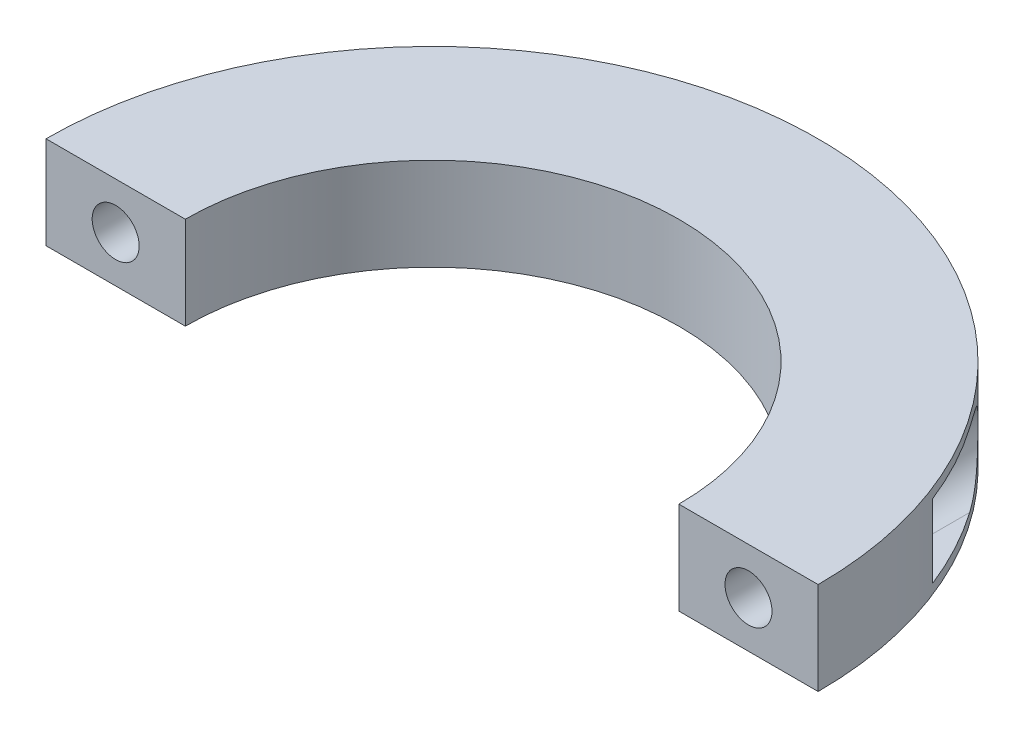
ISO-10303-21;
HEADER;
FILE_DESCRIPTION(('STEP AP214'),'2;1');
FILE_NAME('part.step','',(''),(''),'','','');
FILE_SCHEMA(('AUTOMOTIVE_DESIGN { 1 0 10303 214 1 1 1 1 }'));
ENDSEC;
DATA;
#1=APPLICATION_CONTEXT('core data for automotive mechanical design processes');
#2=APPLICATION_PROTOCOL_DEFINITION('international standard','automotive_design',2000,#1);
#3=PRODUCT_CONTEXT('',#1,'mechanical');
#4=PRODUCT('Part','Part','',(#3));
#5=PRODUCT_RELATED_PRODUCT_CATEGORY('part','',(#4));
#6=PRODUCT_DEFINITION_FORMATION('','',#4);
#7=PRODUCT_DEFINITION_CONTEXT('part definition',#1,'design');
#8=PRODUCT_DEFINITION('design','',#6,#7);
#9=PRODUCT_DEFINITION_SHAPE('','',#8);
#10=(LENGTH_UNIT() NAMED_UNIT(*) SI_UNIT(.MILLI.,.METRE.));
#11=(NAMED_UNIT(*) PLANE_ANGLE_UNIT() SI_UNIT($,.RADIAN.));
#12=(NAMED_UNIT(*) SI_UNIT($,.STERADIAN.) SOLID_ANGLE_UNIT());
#13=UNCERTAINTY_MEASURE_WITH_UNIT(LENGTH_MEASURE(1.E-05),#10,'distance_accuracy_value','');
#14=(GEOMETRIC_REPRESENTATION_CONTEXT(3) GLOBAL_UNCERTAINTY_ASSIGNED_CONTEXT((#13)) GLOBAL_UNIT_ASSIGNED_CONTEXT((#10,
#11,#12)) REPRESENTATION_CONTEXT('',''));
#15=CARTESIAN_POINT('',(0.,0.,0.));
#16=DIRECTION('',(0.,0.,1.));
#17=DIRECTION('',(1.,0.,0.));
#18=AXIS2_PLACEMENT_3D('',#15,#16,#17);
#19=CARTESIAN_POINT('',(0.,7.2,0.));
#20=DIRECTION('',(0.,-1.,0.));
#21=DIRECTION('',(0.,0.,-1.));
#22=AXIS2_PLACEMENT_3D('',#19,#20,#21);
#23=CYLINDRICAL_SURFACE('',#22,30.);
#24=CARTESIAN_POINT('',(0.,6.44999999999995,0.));
#25=DIRECTION('',(0.,-1.,0.));
#26=DIRECTION('',(1.,0.,0.));
#27=AXIS2_PLACEMENT_3D('',#24,#25,#26);
#28=CIRCLE('',#27,30.);
#29=CARTESIAN_POINT('',(24.5875,6.44999999999994,-17.1887999508398));
#30=VERTEX_POINT('',#29);
#31=CARTESIAN_POINT('',(27.9319285590807,6.44999999999994,-10.9456551640553));
#32=VERTEX_POINT('',#31);
#33=EDGE_CURVE('E265',#30,#32,#28,.T.);
#34=ORIENTED_EDGE('',*,*,#33,.F.);
#35=CARTESIAN_POINT('',(27.4375000000002,3.59999999999976,-12.1319245690858));
#36=CARTESIAN_POINT('',(27.4375013071134,3.52763496158532,-12.131921385579));
#37=CARTESIAN_POINT('',(27.4347141630481,3.45527897047231,-12.1382307373313));
#38=CARTESIAN_POINT('',(27.4239109642975,3.31297405428067,-12.1626179950889));
#39=CARTESIAN_POINT('',(27.41588861663,3.24302813289689,-12.1807100644699));
#40=CARTESIAN_POINT('',(27.392664386575,3.08897208646284,-12.232863135744));
#41=CARTESIAN_POINT('',(27.3761138030832,3.00609610280484,-12.2699060718409));
#42=CARTESIAN_POINT('',(27.3376583643406,2.84779726913298,-12.3553479404523));
#43=CARTESIAN_POINT('',(27.3157411742984,2.77239215937579,-12.4037730236581));
#44=CARTESIAN_POINT('',(27.271291786194,2.6387501320794,-12.5011641226569));
#45=CARTESIAN_POINT('',(27.2492699706443,2.57958455218698,-12.5491163333815));
#46=CARTESIAN_POINT('',(27.2028908370105,2.46598424482691,-12.6493396392788));
#47=CARTESIAN_POINT('',(27.1785317205823,2.41155322256817,-12.7016140556566));
#48=CARTESIAN_POINT('',(27.1025410708424,2.25438332239792,-12.863373937481));
#49=CARTESIAN_POINT('',(27.0480641352015,2.15795918474619,-12.9776461775797));
#50=CARTESIAN_POINT('',(26.9310427443749,1.97437430409749,-13.2188433877007));
#51=CARTESIAN_POINT('',(26.8682424590678,1.8878436954076,-13.3461085814315));
#52=CARTESIAN_POINT('',(26.7377505119227,1.72658783294391,-13.6056542112895));
#53=CARTESIAN_POINT('',(26.6700539619856,1.65187462069984,-13.7379395948435));
#54=CARTESIAN_POINT('',(26.530326730278,1.51249528016397,-14.0058794353399));
#55=CARTESIAN_POINT('',(26.4582867958105,1.44785173344354,-14.1415406952223));
#56=CARTESIAN_POINT('',(26.3103881578095,1.32772736255812,-14.414841142442));
#57=CARTESIAN_POINT('',(26.234528460183,1.27224893986562,-14.5524808379378));
#58=CARTESIAN_POINT('',(26.034518284812,1.14029096486436,-14.9085959317968));
#59=CARTESIAN_POINT('',(25.9077282458134,1.07012940210633,-15.1279522367004));
#60=CARTESIAN_POINT('',(25.6460300601194,0.949956612811483,-15.5674872394132));
#61=CARTESIAN_POINT('',(25.511116750821,0.899958359433383,-15.7876663749942));
#62=CARTESIAN_POINT('',(25.2340910620693,0.820584781233433,-16.2267660606024));
#63=CARTESIAN_POINT('',(25.0919896079403,0.791179110861146,-16.4456879890716));
#64=CARTESIAN_POINT('',(24.8012660009318,0.754255574837377,-16.8809236728404));
#65=CARTESIAN_POINT('',(24.6526483609005,0.746722796561631,-17.0972391049633));
#66=CARTESIAN_POINT('',(24.4067712791091,0.754165128537925,-17.4452410913527));
#67=CARTESIAN_POINT('',(24.3111394915672,0.761762551153272,-17.578260097412));
#68=CARTESIAN_POINT('',(24.1181978148581,0.787220978680312,-17.8420629964354));
#69=CARTESIAN_POINT('',(24.0208883638315,0.80507934206821,-17.9728474557301));
#70=CARTESIAN_POINT('',(23.825245561511,0.851986870799555,-18.2313990972942));
#71=CARTESIAN_POINT('',(23.7269135844038,0.881022533409595,-18.3591697235284));
#72=CARTESIAN_POINT('',(23.5299317587771,0.951419109480973,-18.6109610336307));
#73=CARTESIAN_POINT('',(23.4312820347235,0.992775668374705,-18.7349830253473));
#74=CARTESIAN_POINT('',(23.1964056158701,1.10790701796649,-19.0256097602249));
#75=CARTESIAN_POINT('',(23.0604785770986,1.18803431567793,-19.1900267560077));
#76=CARTESIAN_POINT('',(22.7943371076432,1.37878359656918,-19.5053977685648));
#77=CARTESIAN_POINT('',(22.664114679237,1.48936119267547,-19.6563709615263));
#78=CARTESIAN_POINT('',(22.4519846861562,1.70839589810764,-19.8979001452481));
#79=CARTESIAN_POINT('',(22.3669361842197,1.80835542338603,-19.9933612184164));
#80=CARTESIAN_POINT('',(22.2071313500556,2.02691269928251,-20.1707085909834));
#81=CARTESIAN_POINT('',(22.1323601835278,2.14548304570843,-20.2526144915342));
#82=CARTESIAN_POINT('',(22.011988192875,2.37432108863106,-20.3832920818555));
#83=CARTESIAN_POINT('',(21.9635556150761,2.48116964478879,-20.4354117260273));
#84=CARTESIAN_POINT('',(21.8789887469203,2.70514793140239,-20.5259274104804));
#85=CARTESIAN_POINT('',(21.8428477295105,2.8222719938739,-20.5643309580288));
#86=CARTESIAN_POINT('',(21.7853372733436,3.06515649097673,-20.6252487195521));
#87=CARTESIAN_POINT('',(21.7640824399848,3.19097591053168,-20.6476396834148));
#88=CARTESIAN_POINT('',(21.738771157838,3.44621396318732,-20.6742882581611));
#89=CARTESIAN_POINT('',(21.7347035115728,3.57563019761223,-20.6785576752668));
#90=CARTESIAN_POINT('',(21.743534852317,3.81711230765608,-20.669269338681));
#91=CARTESIAN_POINT('',(21.7544004930018,3.92934705661729,-20.6578481306386));
#92=CARTESIAN_POINT('',(21.7887742756065,4.14959808599776,-20.6215890157432));
#93=CARTESIAN_POINT('',(21.8122829654545,4.25761418337025,-20.5967505274081));
#94=CARTESIAN_POINT('',(21.8707399867435,4.4682266301039,-20.5346669709631));
#95=CARTESIAN_POINT('',(21.9058246340927,4.57074059504893,-20.4972739666128));
#96=CARTESIAN_POINT('',(21.9853656189716,4.76733203650228,-20.4119354877624));
#97=CARTESIAN_POINT('',(22.0298262200137,4.8614056471058,-20.3639852121326));
#98=CARTESIAN_POINT('',(22.1500888485115,5.08480287144856,-20.2332595049233));
#99=CARTESIAN_POINT('',(22.2304961119897,5.20845735698127,-20.1450094197484));
#100=CARTESIAN_POINT('',(22.402257796715,5.43508745629518,-19.9538344434393));
#101=CARTESIAN_POINT('',(22.4936381133116,5.53801255667037,-19.8508747259643));
#102=CARTESIAN_POINT('',(22.7264121062227,5.76711604433356,-19.5845300816595));
#103=CARTESIAN_POINT('',(22.8715648476644,5.88239928441977,-19.4150462855235));
#104=CARTESIAN_POINT('',(23.0931449607726,6.02842264957083,-19.1499399226335));
#105=CARTESIAN_POINT('',(23.1677307604233,6.0726472103822,-19.0596526679444));
#106=CARTESIAN_POINT('',(23.3175845460396,6.15284741721578,-18.8760226375766));
#107=CARTESIAN_POINT('',(23.392852382389,6.18882482892975,-18.7826805208351));
#108=CARTESIAN_POINT('',(23.5844380751101,6.27064920081888,-18.5420899440814));
#109=CARTESIAN_POINT('',(23.7008344485953,6.31123379226483,-18.3931143299668));
#110=CARTESIAN_POINT('',(23.9324263176575,6.37630118569585,-18.0907515400933));
#111=CARTESIAN_POINT('',(24.0476211352845,6.40077533524112,-17.9373620398458));
#112=CARTESIAN_POINT('',(24.2761200503692,6.4353011858254,-17.6268902111297));
#113=CARTESIAN_POINT('',(24.38941731343,6.44530869263672,-17.469798050587));
#114=CARTESIAN_POINT('',(24.6130393969964,6.45207920132206,-17.1533045882167));
#115=CARTESIAN_POINT('',(24.7233645521019,6.44884370041939,-16.9939035494559));
#116=CARTESIAN_POINT('',(24.9788078686468,6.42685633431674,-16.6170866714167));
#117=CARTESIAN_POINT('',(25.1225080991694,6.4030450393245,-16.3989941591723));
#118=CARTESIAN_POINT('',(25.4027979714058,6.33470482203513,-15.9613742961862));
#119=CARTESIAN_POINT('',(25.5393832456993,6.29016333760671,-15.7418461551192));
#120=CARTESIAN_POINT('',(25.8041671097167,6.1812112023467,-15.3039239053613));
#121=CARTESIAN_POINT('',(25.9323987161044,6.11688535277503,-15.085528926199));
#122=CARTESIAN_POINT('',(26.1183130056087,6.00506110761765,-14.7597217943716));
#123=CARTESIAN_POINT('',(26.1791947323433,5.96524486740382,-14.6514495890708));
#124=CARTESIAN_POINT('',(26.2987306380206,5.88025661230051,-14.4357872825435));
#125=CARTESIAN_POINT('',(26.3573850697788,5.8350852076781,-14.3283970822934));
#126=CARTESIAN_POINT('',(26.4925258682194,5.72217643492951,-14.0773896535747));
#127=CARTESIAN_POINT('',(26.568039434143,5.6520857414958,-13.9342965879296));
#128=CARTESIAN_POINT('',(26.714561222648,5.49982736862298,-13.6512878220905));
#129=CARTESIAN_POINT('',(26.7855502079413,5.41761248534153,-13.5113871273592));
#130=CARTESIAN_POINT('',(26.897272935684,5.27110931531093,-13.2870732276796));
#131=CARTESIAN_POINT('',(26.9397120391519,5.21099547696181,-13.2007860503539));
#132=CARTESIAN_POINT('',(27.0218610649725,5.08395491817626,-13.0318010906103));
#133=CARTESIAN_POINT('',(27.0615684070959,5.01702190090164,-12.9491067281509));
#134=CARTESIAN_POINT('',(27.1373118888219,4.87567692624766,-12.7896068189572));
#135=CARTESIAN_POINT('',(27.1733709663312,4.80131841168086,-12.7127653415437));
#136=CARTESIAN_POINT('',(27.2410259665605,4.64339088101278,-12.567135896736));
#137=CARTESIAN_POINT('',(27.2726326587013,4.55984499122431,-12.4983285679009));
#138=CARTESIAN_POINT('',(27.321830395117,4.40653385232312,-12.3903224255681));
#139=CARTESIAN_POINT('',(27.340881931822,4.33933079839839,-12.3481935071426));
#140=CARTESIAN_POINT('',(27.3747689289343,4.19902194507246,-12.2728858948862));
#141=CARTESIAN_POINT('',(27.3896078234196,4.12592101631919,-12.2396999120454));
#142=CARTESIAN_POINT('',(27.4131766420327,3.9785463697548,-12.1868187885599));
#143=CARTESIAN_POINT('',(27.4221962945721,3.90455546068919,-12.1664850667459));
#144=CARTESIAN_POINT('',(27.4343527092337,3.75370320013962,-12.1390499271755));
#145=CARTESIAN_POINT('',(27.4374986119395,3.67684649878406,-12.1319279497424));
#146=CARTESIAN_POINT('',(27.4375000000002,3.59999999999976,-12.1319245690858));
#147=B_SPLINE_CURVE_WITH_KNOTS('',3,(#35,#36,#37,#38,#39,#40,#41,#42,#43,#44,#45,#46,#47,#48,
#49,#50,#51,#52,#53,#54,#55,#56,#57,#58,#59,#60,#61,#62,#63,#64,#65,#66,#67,#68,#69,#70,#71,#72,
#73,#74,#75,#76,#77,#78,#79,#80,#81,#82,#83,#84,#85,#86,#87,#88,#89,#90,#91,#92,#93,#94,#95,#96,
#97,#98,#99,#100,#101,#102,#103,#104,#105,#106,#107,#108,#109,#110,#111,#112,#113,#114,#115,
#116,#117,#118,#119,#120,#121,#122,#123,#124,#125,#126,#127,#128,#129,#130,#131,#132,#133,#134,
#135,#136,#137,#138,#139,#140,#141,#142,#143,#144,#145,#146),.UNSPECIFIED.,.T.,.F.,(4,2,2,2,2,2,
2,2,2,2,2,2,2,2,2,2,2,2,2,2,2,2,2,2,2,2,2,2,2,2,2,2,2,2,2,2,2,2,2,2,2,2,2,2,2,2,2,2,2,2,2,2,2,2,
2,4),(0.,0.216775990502833,0.433813037994178,0.709075067334167,0.984975806954632,
1.22246738907446,1.46014318780746,1.93624458755349,2.4342462494137,2.93275213382013,
3.43236032193983,3.9320992119304,4.71978353921637,5.50797386046147,6.29500023410612,
7.08148989831726,7.57320797797736,8.06479952894493,8.55579906715021,9.04662527711158,
9.72824900638224,10.4088843521423,10.8941995682715,11.378806754636,11.762423735809,
12.1458304279608,12.5321573644621,12.9182325695613,13.2566272964081,13.5950366898843,
13.937582505229,14.2802844230678,14.793022637456,15.3069955658761,16.056043404108,
16.4313916103044,16.8066593802783,17.3858726008741,17.9653966464293,18.5466873689104,
19.1279123738438,19.9136654072563,20.699895214436,21.4828009118339,21.8740161769203,
22.2651869024388,22.793751085536,23.3244303216622,23.6644130193147,24.0047125528553,
24.3427187050704,24.6798927095017,24.9239914638225,25.1678906576169,25.3984503575875,
25.6286509662743),.UNSPECIFIED.);
#148=CARTESIAN_POINT('',(24.5875,0.749999999999945,-17.1887999508398));
#149=VERTEX_POINT('',#148);
#150=EDGE_CURVE('E213',#149,#30,#147,.T.);
#151=ORIENTED_EDGE('',*,*,#150,.F.);
#152=CARTESIAN_POINT('',(0.,0.749999999999948,0.));
#153=DIRECTION('',(0.,1.,0.));
#154=DIRECTION('',(-1.,0.,0.));
#155=AXIS2_PLACEMENT_3D('',#152,#153,#154);
#156=CIRCLE('',#155,30.);
#157=CARTESIAN_POINT('',(27.9319285590807,0.749999999999945,-10.9456551640553));
#158=VERTEX_POINT('',#157);
#159=EDGE_CURVE('E275',#158,#149,#156,.T.);
#160=ORIENTED_EDGE('',*,*,#159,.F.);
#161=DIRECTION('',(0.,-1.,0.));
#162=VECTOR('',#161,1.);
#163=CARTESIAN_POINT('',(27.9319285590807,7.2,-10.9456551640553));
#164=LINE('',#163,#162);
#165=EDGE_CURVE('E161',#32,#158,#164,.T.);
#166=ORIENTED_EDGE('',*,*,#165,.F.);
#167=EDGE_LOOP('',(#34,#151,#160,#166));
#168=FACE_BOUND('',#167,.T.);
#169=CARTESIAN_POINT('',(0.,0.,0.));
#170=DIRECTION('',(0.,1.,0.));
#171=DIRECTION('',(0.,0.,-1.));
#172=AXIS2_PLACEMENT_3D('',#169,#170,#171);
#173=CIRCLE('',#172,30.);
#174=CARTESIAN_POINT('',(30.,0.,0.));
#175=VERTEX_POINT('',#174);
#176=CARTESIAN_POINT('',(-30.,0.,0.));
#177=VERTEX_POINT('',#176);
#178=EDGE_CURVE('E196',#175,#177,#173,.T.);
#179=ORIENTED_EDGE('',*,*,#178,.T.);
#180=DIRECTION('',(0.,-1.,0.));
#181=VECTOR('',#180,1.);
#182=CARTESIAN_POINT('',(-30.,7.2,0.));
#183=LINE('',#182,#181);
#184=CARTESIAN_POINT('',(-30.,7.2,0.));
#185=VERTEX_POINT('',#184);
#186=EDGE_CURVE('E204',#185,#177,#183,.T.);
#187=ORIENTED_EDGE('',*,*,#186,.F.);
#188=CARTESIAN_POINT('',(0.,7.2,0.));
#189=DIRECTION('',(0.,1.,0.));
#190=DIRECTION('',(0.,0.,-1.));
#191=AXIS2_PLACEMENT_3D('',#188,#189,#190);
#192=CIRCLE('',#191,30.);
#193=CARTESIAN_POINT('',(30.,7.2,0.));
#194=VERTEX_POINT('',#193);
#195=EDGE_CURVE('E183',#194,#185,#192,.T.);
#196=ORIENTED_EDGE('',*,*,#195,.F.);
#197=DIRECTION('',(0.,-1.,0.));
#198=VECTOR('',#197,1.);
#199=CARTESIAN_POINT('',(30.,7.2,0.));
#200=LINE('',#199,#198);
#201=EDGE_CURVE('E58',#194,#175,#200,.T.);
#202=ORIENTED_EDGE('',*,*,#201,.T.);
#203=EDGE_LOOP('',(#179,#187,#196,#202));
#204=FACE_BOUND('',#203,.T.);
#205=CARTESIAN_POINT('',(0.,0.749999999999949,0.));
#206=DIRECTION('',(0.,1.,0.));
#207=DIRECTION('',(-1.,0.,0.));
#208=AXIS2_PLACEMENT_3D('',#205,#206,#207);
#209=CIRCLE('',#208,30.);
#210=CARTESIAN_POINT('',(-24.5875,0.749999999999951,-17.1887999508401));
#211=VERTEX_POINT('',#210);
#212=CARTESIAN_POINT('',(-27.9319285590807,0.749999999999952,-10.9456551640553));
#213=VERTEX_POINT('',#212);
#214=EDGE_CURVE('E134',#211,#213,#209,.T.);
#215=ORIENTED_EDGE('',*,*,#214,.F.);
#216=CARTESIAN_POINT('',(-21.7375,3.60000000000004,-20.6756159219018));
#217=CARTESIAN_POINT('',(-21.7375006618346,3.53820526426916,-20.6756152982519));
#218=CARTESIAN_POINT('',(-21.7395163994261,3.47638736941947,-20.6734967245067));
#219=CARTESIAN_POINT('',(-21.7475264284699,3.35328409268971,-20.6650700875991));
#220=CARTESIAN_POINT('',(-21.7535234973376,3.29199911283437,-20.6587590997659));
#221=CARTESIAN_POINT('',(-21.7773562559361,3.10948684517068,-20.6336455698857));
#222=CARTESIAN_POINT('',(-21.8010330228476,2.98977551653876,-20.6086628694123));
#223=CARTESIAN_POINT('',(-21.8617850000088,2.75906985662507,-20.54420243928));
#224=CARTESIAN_POINT('',(-21.8987647308205,2.64802010052776,-20.5048279722));
#225=CARTESIAN_POINT('',(-21.9836578477102,2.43570386865305,-20.4137862352961));
#226=CARTESIAN_POINT('',(-22.0315706380253,2.33443686022316,-20.3621196352871));
#227=CARTESIAN_POINT('',(-22.1565759147756,2.10455519899752,-20.226161597417));
#228=CARTESIAN_POINT('',(-22.2377095423668,1.98099433899541,-20.1370533713716));
#229=CARTESIAN_POINT('',(-22.4108509259563,1.75470984148108,-19.9441897319759));
#230=CARTESIAN_POINT('',(-22.5028822781394,1.65203277765035,-19.8404024369248));
#231=CARTESIAN_POINT('',(-22.7374520086392,1.42338485080731,-19.5717322772776));
#232=CARTESIAN_POINT('',(-22.8837377784599,1.30845030874685,-19.4007189298467));
#233=CARTESIAN_POINT('',(-23.1069351002101,1.16313327793995,-19.1333039153398));
#234=CARTESIAN_POINT('',(-23.1820558347468,1.11917154111487,-19.0422325126261));
#235=CARTESIAN_POINT('',(-23.3329461210144,1.03955774534599,-18.8570365183605));
#236=CARTESIAN_POINT('',(-23.4087155305634,1.00390391142457,-18.7629125838844));
#237=CARTESIAN_POINT('',(-23.6015770690607,0.922951348108484,-18.520284346442));
#238=CARTESIAN_POINT('',(-23.7187242758761,0.882958172525709,-18.3700536357522));
#239=CARTESIAN_POINT('',(-23.9517365163128,0.819191177320292,-18.0651925952167));
#240=CARTESIAN_POINT('',(-24.0676008277865,0.795426077165131,-17.9105599465819));
#241=CARTESIAN_POINT('',(-24.2972618453261,0.762439789041635,-17.5977497681309));
#242=CARTESIAN_POINT('',(-24.4110534693488,0.753250556496575,-17.4395652185622));
#243=CARTESIAN_POINT('',(-24.63559097569,0.748194815132916,-17.120913202262));
#244=CARTESIAN_POINT('',(-24.7463372064011,0.752326775922782,-16.9604459998793));
#245=CARTESIAN_POINT('',(-25.001599284542,0.77641633507903,-16.5827681129652));
#246=CARTESIAN_POINT('',(-25.1447149001355,0.801301808636567,-16.3649151419227));
#247=CARTESIAN_POINT('',(-25.423819037244,0.871667960245413,-15.9278607609331));
#248=CARTESIAN_POINT('',(-25.5598032963498,0.917160802241271,-15.7086586301044));
#249=CARTESIAN_POINT('',(-25.8238711488862,1.02815013218381,-15.2706570595555));
#250=CARTESIAN_POINT('',(-25.9519588594809,1.0936360881139,-15.0518574686891));
#251=CARTESIAN_POINT('',(-26.137603852782,1.20731948836023,-14.7255342012112));
#252=CARTESIAN_POINT('',(-26.1983894560916,1.24777717031729,-14.6171004214539));
#253=CARTESIAN_POINT('',(-26.3177095418766,1.33410010665663,-14.4011584174445));
#254=CARTESIAN_POINT('',(-26.3762443833883,1.37996449378832,-14.2936500477145));
#255=CARTESIAN_POINT('',(-26.4894230392901,1.47619183589372,-14.0827700556274));
#256=CARTESIAN_POINT('',(-26.5441285693831,1.52640585015809,-13.9793637610627));
#257=CARTESIAN_POINT('',(-26.6510719427412,1.63280365225161,-13.7743863005293));
#258=CARTESIAN_POINT('',(-26.703310450751,1.68898581853716,-13.6728146448212));
#259=CARTESIAN_POINT('',(-26.8049108224699,1.80788126070736,-13.4725395858574));
#260=CARTESIAN_POINT('',(-26.8542807325548,1.87057474112689,-13.3738285920405));
#261=CARTESIAN_POINT('',(-26.9498655708962,2.00361641061665,-13.1801511583061));
#262=CARTESIAN_POINT('',(-26.9960825271215,2.07395960242039,-13.0851823283695));
#263=CARTESIAN_POINT('',(-27.0816037090366,2.21851495893725,-12.9071992998127));
#264=CARTESIAN_POINT('',(-27.1211653742315,2.29211125774806,-12.8238136591454));
#265=CARTESIAN_POINT('',(-27.1961062590202,2.448815246564,-12.6641050925599));
#266=CARTESIAN_POINT('',(-27.2314835959668,2.53192718507663,-12.5877853491176));
#267=CARTESIAN_POINT('',(-27.2909629042949,2.69448003365829,-12.4582321607017));
#268=CARTESIAN_POINT('',(-27.3159606651625,2.77219264151325,-12.4032741905581));
#269=CARTESIAN_POINT('',(-27.360391085134,2.93612067636967,-12.3049543854803));
#270=CARTESIAN_POINT('',(-27.3798381098439,3.02231336363174,-12.2615626361679));
#271=CARTESIAN_POINT('',(-27.4065414557661,3.17611596987538,-12.201730862075));
#272=CARTESIAN_POINT('',(-27.4157006490402,3.24175049569189,-12.1811181570939));
#273=CARTESIAN_POINT('',(-27.4294673068073,3.37584466411686,-12.1500871559742));
#274=CARTESIAN_POINT('',(-27.4340804881334,3.44430064538877,-12.139656056125));
#275=CARTESIAN_POINT('',(-27.4382867860299,3.58247642859632,-12.1301463694743));
#276=CARTESIAN_POINT('',(-27.4378581034933,3.65220041618177,-12.1311170797519));
#277=CARTESIAN_POINT('',(-27.4319790405429,3.79034838516758,-12.1444049903811));
#278=CARTESIAN_POINT('',(-27.4265248097263,3.85877132872195,-12.1567308906891));
#279=CARTESIAN_POINT('',(-27.4096370485405,4.00562548931584,-12.1947652137627));
#280=CARTESIAN_POINT('',(-27.3972380869516,4.08337652389774,-12.2226298177592));
#281=CARTESIAN_POINT('',(-27.3673793733356,4.23294635375672,-12.2893402057241));
#282=CARTESIAN_POINT('',(-27.3499092011498,4.30475253932575,-12.3282085958085));
#283=CARTESIAN_POINT('',(-27.299039346029,4.48518580444078,-12.4405866951923));
#284=CARTESIAN_POINT('',(-27.2625022278093,4.5888284949082,-12.520577901086));
#285=CARTESIAN_POINT('',(-27.1827678660848,4.78240462689147,-12.6927631096004));
#286=CARTESIAN_POINT('',(-27.1395516755249,4.87229757315994,-12.7849917183189));
#287=CARTESIAN_POINT('',(-27.0474823853926,5.04238780496785,-12.9786521195471));
#288=CARTESIAN_POINT('',(-26.9985406025205,5.12237755395447,-13.0802214446501));
#289=CARTESIAN_POINT('',(-26.8966983671856,5.27282886565538,-13.288381409136));
#290=CARTESIAN_POINT('',(-26.843794000691,5.34328080939315,-13.3949769736352));
#291=CARTESIAN_POINT('',(-26.7345638738275,5.47617210880075,-13.611680864136));
#292=CARTESIAN_POINT('',(-26.6782312250349,5.5385944913827,-13.7217960362831));
#293=CARTESIAN_POINT('',(-26.5626056757115,5.65627350456794,-13.944307522404));
#294=CARTESIAN_POINT('',(-26.5033118157454,5.71152779156494,-14.0567045686148));
#295=CARTESIAN_POINT('',(-26.3871293550416,5.81114992197635,-14.2735151421498));
#296=CARTESIAN_POINT('',(-26.3304578093766,5.85604250446959,-14.3778051736131));
#297=CARTESIAN_POINT('',(-26.2149840722736,5.9407086876206,-14.587286531162));
#298=CARTESIAN_POINT('',(-26.1561815903139,5.98048158689474,-14.6924779786382));
#299=CARTESIAN_POINT('',(-25.9766646291812,6.09252192248552,-15.009054049729));
#300=CARTESIAN_POINT('',(-25.8528931636746,6.15746662719493,-15.2213421358227));
#301=CARTESIAN_POINT('',(-25.5979144220999,6.26849738229138,-15.6463496921184));
#302=CARTESIAN_POINT('',(-25.4667064190442,6.31458158526396,-15.8590692025292));
#303=CARTESIAN_POINT('',(-25.1974927528399,6.38744402668917,-16.2834092696626));
#304=CARTESIAN_POINT('',(-25.0594907062597,6.41423242037046,-16.4950303461731));
#305=CARTESIAN_POINT('',(-24.8108568526276,6.44329645106515,-16.8659051493779));
#306=CARTESIAN_POINT('',(-24.7014929478668,6.44987793122209,-17.0256793456032));
#307=CARTESIAN_POINT('',(-24.4796526896578,6.45011875579802,-17.343127933336));
#308=CARTESIAN_POINT('',(-24.3671759854625,6.44377663810265,-17.500802085223));
#309=CARTESIAN_POINT('',(-24.1400109498877,6.41696763879704,-17.8128328999814));
#310=CARTESIAN_POINT('',(-24.0253281637256,6.39653256815285,-17.967196228635));
#311=CARTESIAN_POINT('',(-23.7944798192462,6.34002363626211,-18.2718154090388));
#312=CARTESIAN_POINT('',(-23.6783150606047,6.30395788948576,-18.4220733490828));
#313=CARTESIAN_POINT('',(-23.4178701004507,6.20353063603166,-18.7525325526384));
#314=CARTESIAN_POINT('',(-23.2735142159183,6.13446314954189,-18.9312944627747));
#315=CARTESIAN_POINT('',(-22.9883614885165,5.96489465610228,-19.2765431731252));
#316=CARTESIAN_POINT('',(-22.8475610327986,5.86442707019663,-19.4430427931052));
#317=CARTESIAN_POINT('',(-22.6112709066108,5.65787394880706,-19.7168524043466));
#318=CARTESIAN_POINT('',(-22.5134909475839,5.55998328208999,-19.828323382461));
#319=CARTESIAN_POINT('',(-22.3276511398227,5.34240456833959,-20.0373507828136));
#320=CARTESIAN_POINT('',(-22.2395758716697,5.22275192407534,-20.1349293524079));
#321=CARTESIAN_POINT('',(-22.0982936869701,4.99279959919402,-20.2897426641678));
#322=CARTESIAN_POINT('',(-22.0418088459452,4.88725742527918,-20.351024088768));
#323=CARTESIAN_POINT('',(-21.9407330446514,4.6639930621356,-20.459954934493));
#324=CARTESIAN_POINT('',(-21.8961341709806,4.5462790494704,-20.5076134269921));
#325=CARTESIAN_POINT('',(-21.8273144659772,4.31832613044138,-20.5808288809439));
#326=CARTESIAN_POINT('',(-21.8011026646978,4.20938788499811,-20.6085594749449));
#327=CARTESIAN_POINT('',(-21.7616197813655,3.9867752656549,-20.6502482266359));
#328=CARTESIAN_POINT('',(-21.7483139449321,3.87311447575907,-20.664243373626));
#329=CARTESIAN_POINT('',(-21.7404528308851,3.73240298108454,-20.6725109474864));
#330=CARTESIAN_POINT('',(-21.7393467115,3.70595261685476,-20.6736741878158));
#331=CARTESIAN_POINT('',(-21.7378701112283,3.65300292537869,-20.6752268538903));
#332=CARTESIAN_POINT('',(-21.737499716141,3.62650359278242,-20.6756161893835));
#333=CARTESIAN_POINT('',(-21.7375,3.60000000000004,-20.6756159219018));
#334=B_SPLINE_CURVE_WITH_KNOTS('',3,(#216,#217,#218,#219,#220,#221,#222,#223,#224,#225,#226,
#227,#228,#229,#230,#231,#232,#233,#234,#235,#236,#237,#238,#239,#240,#241,#242,#243,#244,#245,
#246,#247,#248,#249,#250,#251,#252,#253,#254,#255,#256,#257,#258,#259,#260,#261,#262,#263,#264,
#265,#266,#267,#268,#269,#270,#271,#272,#273,#274,#275,#276,#277,#278,#279,#280,#281,#282,#283,
#284,#285,#286,#287,#288,#289,#290,#291,#292,#293,#294,#295,#296,#297,#298,#299,#300,#301,#302,
#303,#304,#305,#306,#307,#308,#309,#310,#311,#312,#313,#314,#315,#316,#317,#318,#319,#320,#321,
#322,#323,#324,#325,#326,#327,#328,#329,#330,#331,#332,#333),.UNSPECIFIED.,.T.,.F.,(4,2,2,2,2,2,
2,2,2,2,2,2,2,2,2,2,2,2,2,2,2,2,2,2,2,2,2,2,2,2,2,2,2,2,2,2,2,2,2,2,2,2,2,2,2,2,2,2,2,2,2,2,2,2,
2,2,2,2,4),(0.,0.185348788290663,0.370827013757108,0.74229529065651,1.11114894653319,
1.47998250767871,1.99489629640795,2.51094611662333,3.2645600518397,3.64228546131602,
4.01993009587841,4.60302797378646,5.18643890858245,5.77112712602257,6.35574817455452,
7.14025555680581,7.92522661613451,8.70978487808406,9.10186013092468,9.49387257915561,
9.87563730878088,10.2572985771604,10.6378317332973,11.0181177781097,11.3717739270724,
11.7255885954378,12.0199728505046,12.313588168012,12.5209851818387,12.7281210496412,
12.9361528224271,13.1443441146829,13.3935046685356,13.6431808579365,14.0486598209104,
14.4553108981801,14.8694037437973,15.2839111438926,15.6992808242547,16.1147859691492,
16.4953491536239,16.875964418929,17.6375535843754,18.3992173307799,19.1604799262328,
19.7412590296922,20.3221038433836,20.9016418325664,21.4808793215524,22.1987331219099,
22.9158254537736,23.4471864729811,23.9776906734513,24.3796645282236,24.7813700857297,
25.1262111621583,25.4701210188825,25.5496073371011,25.6291029243782),.UNSPECIFIED.);
#335=CARTESIAN_POINT('',(-24.5875,6.44999999999995,-17.1887999508401));
#336=VERTEX_POINT('',#335);
#337=EDGE_CURVE('E47',#336,#211,#334,.T.);
#338=ORIENTED_EDGE('',*,*,#337,.F.);
#339=CARTESIAN_POINT('',(0.,6.44999999999995,0.));
#340=DIRECTION('',(0.,-1.,0.));
#341=DIRECTION('',(0.,0.,-1.));
#342=AXIS2_PLACEMENT_3D('',#339,#340,#341);
#343=CIRCLE('',#342,30.);
#344=CARTESIAN_POINT('',(-27.9319285590807,6.44999999999995,-10.9456551640553));
#345=VERTEX_POINT('',#344);
#346=EDGE_CURVE('E147',#345,#336,#343,.T.);
#347=ORIENTED_EDGE('',*,*,#346,.F.);
#348=DIRECTION('',(0.,-1.,0.));
#349=VECTOR('',#348,1.);
#350=CARTESIAN_POINT('',(-27.9319285590807,7.2,-10.9456551640553));
#351=LINE('',#350,#349);
#352=EDGE_CURVE('E270',#345,#213,#351,.T.);
#353=ORIENTED_EDGE('',*,*,#352,.T.);
#354=EDGE_LOOP('',(#215,#338,#347,#353));
#355=FACE_BOUND('',#354,.T.);
#356=ADVANCED_FACE('F43',(#168,#204,#355),#23,.T.);
#357=CARTESIAN_POINT('',(24.5875000000002,3.59999999999982,-21.4456551640557));
#358=DIRECTION('',(0.,0.,1.));
#359=DIRECTION('',(1.,0.,0.));
#360=AXIS2_PLACEMENT_3D('',#357,#358,#359);
#361=CYLINDRICAL_SURFACE('',#360,2.85);
#362=ORIENTED_EDGE('',*,*,#150,.T.);
#363=DIRECTION('',(0.,0.,1.));
#364=VECTOR('',#363,1.);
#365=CARTESIAN_POINT('',(24.5875,6.44999999999994,-30.9456551640553));
#366=LINE('',#365,#364);
#367=CARTESIAN_POINT('',(24.5875,6.44999999999994,-10.9456551640553));
#368=VERTEX_POINT('',#367);
#369=EDGE_CURVE('E295',#30,#368,#366,.T.);
#370=ORIENTED_EDGE('',*,*,#369,.T.);
#371=CARTESIAN_POINT('',(24.5875000000003,3.59999999999975,-10.9456551640557));
#372=DIRECTION('',(0.,0.,-1.));
#373=DIRECTION('',(-1.,0.,0.));
#374=AXIS2_PLACEMENT_3D('',#371,#372,#373);
#375=CIRCLE('',#374,2.85);
#376=CARTESIAN_POINT('',(24.5875000000003,0.749999999999945,-10.9456551640557));
#377=VERTEX_POINT('',#376);
#378=EDGE_CURVE('E154',#377,#368,#375,.T.);
#379=ORIENTED_EDGE('',*,*,#378,.F.);
#380=DIRECTION('',(0.,0.,1.));
#381=VECTOR('',#380,1.);
#382=CARTESIAN_POINT('',(24.5875,0.749999999999945,-30.9456551640553));
#383=LINE('',#382,#381);
#384=EDGE_CURVE('E290',#149,#377,#383,.T.);
#385=ORIENTED_EDGE('',*,*,#384,.F.);
#386=EDGE_LOOP('',(#362,#370,#379,#385));
#387=FACE_BOUND('',#386,.T.);
#388=ADVANCED_FACE('F222',(#387),#361,.F.);
#389=CARTESIAN_POINT('',(-24.5875,3.60000000000004,-21.4456551640553));
#390=DIRECTION('',(0.,0.,1.));
#391=DIRECTION('',(1.,0.,0.));
#392=AXIS2_PLACEMENT_3D('',#389,#390,#391);
#393=CYLINDRICAL_SURFACE('',#392,2.85);
#394=ORIENTED_EDGE('',*,*,#337,.T.);
#395=DIRECTION('',(0.,0.,1.));
#396=VECTOR('',#395,1.);
#397=CARTESIAN_POINT('',(-24.5875,0.749999999999951,-30.9456551640553));
#398=LINE('',#397,#396);
#399=CARTESIAN_POINT('',(-24.5875,0.749999999999951,-10.9456551640553));
#400=VERTEX_POINT('',#399);
#401=EDGE_CURVE('E132',#211,#400,#398,.T.);
#402=ORIENTED_EDGE('',*,*,#401,.T.);
#403=CARTESIAN_POINT('',(-24.5875,3.59999999999997,-10.9456551640553));
#404=DIRECTION('',(0.,0.,-1.));
#405=DIRECTION('',(-1.,0.,0.));
#406=AXIS2_PLACEMENT_3D('',#403,#404,#405);
#407=CIRCLE('',#406,2.85);
#408=CARTESIAN_POINT('',(-24.5875,6.44999999999995,-10.9456551640553));
#409=VERTEX_POINT('',#408);
#410=EDGE_CURVE('E144',#409,#400,#407,.T.);
#411=ORIENTED_EDGE('',*,*,#410,.F.);
#412=DIRECTION('',(0.,0.,1.));
#413=VECTOR('',#412,1.);
#414=CARTESIAN_POINT('',(-24.5875,6.44999999999995,-30.9456551640553));
#415=LINE('',#414,#413);
#416=EDGE_CURVE('E148',#336,#409,#415,.T.);
#417=ORIENTED_EDGE('',*,*,#416,.F.);
#418=EDGE_LOOP('',(#394,#402,#411,#417));
#419=FACE_BOUND('',#418,.T.);
#420=ADVANCED_FACE('F142',(#419),#393,.F.);
#421=CARTESIAN_POINT('',(-24.5875,3.6,-47.2));
#422=DIRECTION('',(0.,0.,1.));
#423=DIRECTION('',(1.,0.,0.));
#424=AXIS2_PLACEMENT_3D('',#421,#422,#423);
#425=CYLINDRICAL_SURFACE('',#424,1.825);
#426=CARTESIAN_POINT('',(-24.5875,3.6,0.));
#427=DIRECTION('',(0.,0.,1.));
#428=DIRECTION('',(1.,0.,0.));
#429=AXIS2_PLACEMENT_3D('',#426,#427,#428);
#430=CIRCLE('',#429,1.825);
#431=CARTESIAN_POINT('',(-22.7625,3.6,0.));
#432=VERTEX_POINT('',#431);
#433=EDGE_CURVE('E166',#432,#432,#430,.T.);
#434=ORIENTED_EDGE('',*,*,#433,.T.);
#435=EDGE_LOOP('',(#434));
#436=FACE_BOUND('',#435,.T.);
#437=CARTESIAN_POINT('',(-24.5875,3.6,-10.9456551640553));
#438=DIRECTION('',(0.,0.,-1.));
#439=DIRECTION('',(-1.,0.,0.));
#440=AXIS2_PLACEMENT_3D('',#437,#438,#439);
#441=CIRCLE('',#440,1.825);
#442=CARTESIAN_POINT('',(-26.4125,3.6,-10.9456551640553));
#443=VERTEX_POINT('',#442);
#444=EDGE_CURVE('E159',#443,#443,#441,.F.);
#445=ORIENTED_EDGE('',*,*,#444,.F.);
#446=EDGE_LOOP('',(#445));
#447=FACE_BOUND('',#446,.T.);
#448=ADVANCED_FACE('F233',(#436,#447),#425,.F.);
#449=CARTESIAN_POINT('',(24.5875,3.6,-47.2));
#450=DIRECTION('',(0.,0.,1.));
#451=DIRECTION('',(1.,0.,0.));
#452=AXIS2_PLACEMENT_3D('',#449,#450,#451);
#453=CYLINDRICAL_SURFACE('',#452,1.825);
#454=CARTESIAN_POINT('',(24.5875,3.6,0.));
#455=DIRECTION('',(0.,0.,1.));
#456=DIRECTION('',(1.,0.,0.));
#457=AXIS2_PLACEMENT_3D('',#454,#455,#456);
#458=CIRCLE('',#457,1.825);
#459=CARTESIAN_POINT('',(26.4125,3.6,0.));
#460=VERTEX_POINT('',#459);
#461=EDGE_CURVE('E171',#460,#460,#458,.T.);
#462=ORIENTED_EDGE('',*,*,#461,.T.);
#463=EDGE_LOOP('',(#462));
#464=FACE_BOUND('',#463,.T.);
#465=CARTESIAN_POINT('',(24.5875,3.6,-10.9456551640557));
#466=DIRECTION('',(0.,0.,-1.));
#467=DIRECTION('',(-1.,0.,0.));
#468=AXIS2_PLACEMENT_3D('',#465,#466,#467);
#469=CIRCLE('',#468,1.825);
#470=CARTESIAN_POINT('',(22.7625,3.6,-10.9456551640557));
#471=VERTEX_POINT('',#470);
#472=EDGE_CURVE('E153',#471,#471,#469,.F.);
#473=ORIENTED_EDGE('',*,*,#472,.F.);
#474=EDGE_LOOP('',(#473));
#475=FACE_BOUND('',#474,.T.);
#476=ADVANCED_FACE('F236',(#464,#475),#453,.F.);
#477=CARTESIAN_POINT('',(0.,7.2,0.));
#478=DIRECTION('',(0.,-1.,0.));
#479=DIRECTION('',(0.,0.,-1.));
#480=AXIS2_PLACEMENT_3D('',#477,#478,#479);
#481=CYLINDRICAL_SURFACE('',#480,19.175);
#482=CARTESIAN_POINT('',(0.,0.,0.));
#483=DIRECTION('',(0.,-1.,0.));
#484=DIRECTION('',(0.,0.,-1.));
#485=AXIS2_PLACEMENT_3D('',#482,#483,#484);
#486=CIRCLE('',#485,19.175);
#487=CARTESIAN_POINT('',(-19.175,0.,0.));
#488=VERTEX_POINT('',#487);
#489=CARTESIAN_POINT('',(19.175,0.,0.));
#490=VERTEX_POINT('',#489);
#491=EDGE_CURVE('E170',#488,#490,#486,.T.);
#492=ORIENTED_EDGE('',*,*,#491,.T.);
#493=DIRECTION('',(0.,-1.,0.));
#494=VECTOR('',#493,1.);
#495=CARTESIAN_POINT('',(19.175,7.2,0.));
#496=LINE('',#495,#494);
#497=CARTESIAN_POINT('',(19.175,7.2,0.));
#498=VERTEX_POINT('',#497);
#499=EDGE_CURVE('E11',#498,#490,#496,.T.);
#500=ORIENTED_EDGE('',*,*,#499,.F.);
#501=CARTESIAN_POINT('',(0.,7.2,0.));
#502=DIRECTION('',(0.,-1.,0.));
#503=DIRECTION('',(0.,0.,-1.));
#504=AXIS2_PLACEMENT_3D('',#501,#502,#503);
#505=CIRCLE('',#504,19.175);
#506=CARTESIAN_POINT('',(-19.175,7.2,0.));
#507=VERTEX_POINT('',#506);
#508=EDGE_CURVE('E175',#507,#498,#505,.T.);
#509=ORIENTED_EDGE('',*,*,#508,.F.);
#510=DIRECTION('',(0.,-1.,0.));
#511=VECTOR('',#510,1.);
#512=CARTESIAN_POINT('',(-19.175,7.2,0.));
#513=LINE('',#512,#511);
#514=EDGE_CURVE('E189',#507,#488,#513,.T.);
#515=ORIENTED_EDGE('',*,*,#514,.T.);
#516=EDGE_LOOP('',(#492,#500,#509,#515));
#517=FACE_BOUND('',#516,.T.);
#518=ADVANCED_FACE('F45',(#517),#481,.F.);
#519=CARTESIAN_POINT('',(19.175,7.2,0.));
#520=DIRECTION('',(0.,0.,-1.));
#521=DIRECTION('',(-1.,0.,0.));
#522=AXIS2_PLACEMENT_3D('',#519,#520,#521);
#523=PLANE('',#522);
#524=ORIENTED_EDGE('',*,*,#461,.F.);
#525=EDGE_LOOP('',(#524));
#526=FACE_BOUND('',#525,.T.);
#527=DIRECTION('',(1.,0.,0.));
#528=VECTOR('',#527,1.);
#529=CARTESIAN_POINT('',(19.175,0.,0.));
#530=LINE('',#529,#528);
#531=EDGE_CURVE('E193',#490,#175,#530,.T.);
#532=ORIENTED_EDGE('',*,*,#531,.T.);
#533=ORIENTED_EDGE('',*,*,#201,.F.);
#534=DIRECTION('',(1.,0.,0.));
#535=VECTOR('',#534,1.);
#536=CARTESIAN_POINT('',(19.175,7.2,0.));
#537=LINE('',#536,#535);
#538=EDGE_CURVE('E179',#498,#194,#537,.T.);
#539=ORIENTED_EDGE('',*,*,#538,.F.);
#540=ORIENTED_EDGE('',*,*,#499,.T.);
#541=EDGE_LOOP('',(#532,#533,#539,#540));
#542=FACE_BOUND('',#541,.T.);
#543=ADVANCED_FACE('F249',(#526,#542),#523,.F.);
#544=CARTESIAN_POINT('',(-19.175,7.2,0.));
#545=DIRECTION('',(0.,0.,-1.));
#546=DIRECTION('',(-1.,0.,0.));
#547=AXIS2_PLACEMENT_3D('',#544,#545,#546);
#548=PLANE('',#547);
#549=ORIENTED_EDGE('',*,*,#433,.F.);
#550=EDGE_LOOP('',(#549));
#551=FACE_BOUND('',#550,.T.);
#552=DIRECTION('',(1.,0.,0.));
#553=VECTOR('',#552,1.);
#554=CARTESIAN_POINT('',(-19.175,0.,0.));
#555=LINE('',#554,#553);
#556=EDGE_CURVE('E180',#177,#488,#555,.T.);
#557=ORIENTED_EDGE('',*,*,#556,.T.);
#558=ORIENTED_EDGE('',*,*,#514,.F.);
#559=DIRECTION('',(1.,0.,0.));
#560=VECTOR('',#559,1.);
#561=CARTESIAN_POINT('',(-19.175,7.2,0.));
#562=LINE('',#561,#560);
#563=EDGE_CURVE('E186',#185,#507,#562,.T.);
#564=ORIENTED_EDGE('',*,*,#563,.F.);
#565=ORIENTED_EDGE('',*,*,#186,.T.);
#566=EDGE_LOOP('',(#557,#558,#564,#565));
#567=FACE_BOUND('',#566,.T.);
#568=ADVANCED_FACE('F244',(#551,#567),#548,.F.);
#569=CARTESIAN_POINT('',(0.,7.2,0.));
#570=DIRECTION('',(0.,-1.,0.));
#571=DIRECTION('',(0.,0.,-1.));
#572=AXIS2_PLACEMENT_3D('',#569,#570,#571);
#573=PLANE('',#572);
#574=ORIENTED_EDGE('',*,*,#508,.T.);
#575=ORIENTED_EDGE('',*,*,#538,.T.);
#576=ORIENTED_EDGE('',*,*,#195,.T.);
#577=ORIENTED_EDGE('',*,*,#563,.T.);
#578=EDGE_LOOP('',(#574,#575,#576,#577));
#579=FACE_BOUND('',#578,.T.);
#580=ADVANCED_FACE('F241',(#579),#573,.F.);
#581=CARTESIAN_POINT('',(0.,0.,0.));
#582=DIRECTION('',(0.,-1.,0.));
#583=DIRECTION('',(0.,0.,-1.));
#584=AXIS2_PLACEMENT_3D('',#581,#582,#583);
#585=PLANE('',#584);
#586=ORIENTED_EDGE('',*,*,#491,.F.);
#587=ORIENTED_EDGE('',*,*,#556,.F.);
#588=ORIENTED_EDGE('',*,*,#178,.F.);
#589=ORIENTED_EDGE('',*,*,#531,.F.);
#590=EDGE_LOOP('',(#586,#587,#588,#589));
#591=FACE_BOUND('',#590,.T.);
#592=ADVANCED_FACE('F232',(#591),#585,.T.);
#593=CARTESIAN_POINT('',(24.5875000000003,3.59999999999975,-10.9456551640557));
#594=DIRECTION('',(0.,0.,-1.));
#595=DIRECTION('',(-1.,0.,0.));
#596=AXIS2_PLACEMENT_3D('',#593,#594,#595);
#597=PLANE('',#596);
#598=ORIENTED_EDGE('',*,*,#378,.T.);
#599=DIRECTION('',(1.,0.,0.));
#600=VECTOR('',#599,1.);
#601=CARTESIAN_POINT('',(30.,6.44999999999994,-10.9456551640553));
#602=LINE('',#601,#600);
#603=EDGE_CURVE('E137',#368,#32,#602,.T.);
#604=ORIENTED_EDGE('',*,*,#603,.T.);
#605=ORIENTED_EDGE('',*,*,#165,.T.);
#606=DIRECTION('',(-1.,0.,0.));
#607=VECTOR('',#606,1.);
#608=CARTESIAN_POINT('',(24.5875,0.749999999999945,-10.9456551640553));
#609=LINE('',#608,#607);
#610=EDGE_CURVE('E66',#158,#377,#609,.T.);
#611=ORIENTED_EDGE('',*,*,#610,.T.);
#612=EDGE_LOOP('',(#598,#604,#605,#611));
#613=FACE_BOUND('',#612,.T.);
#614=ORIENTED_EDGE('',*,*,#472,.T.);
#615=EDGE_LOOP('',(#614));
#616=FACE_BOUND('',#615,.T.);
#617=ADVANCED_FACE('F229',(#613,#616),#597,.T.);
#618=CARTESIAN_POINT('',(-24.5875,3.59999999999997,-10.9456551640553));
#619=DIRECTION('',(0.,0.,-1.));
#620=DIRECTION('',(-1.,0.,0.));
#621=AXIS2_PLACEMENT_3D('',#618,#619,#620);
#622=PLANE('',#621);
#623=ORIENTED_EDGE('',*,*,#410,.T.);
#624=DIRECTION('',(-1.,0.,0.));
#625=VECTOR('',#624,1.);
#626=CARTESIAN_POINT('',(-24.5875,0.749999999999951,-10.9456551640553));
#627=LINE('',#626,#625);
#628=EDGE_CURVE('E129',#400,#213,#627,.T.);
#629=ORIENTED_EDGE('',*,*,#628,.T.);
#630=ORIENTED_EDGE('',*,*,#352,.F.);
#631=DIRECTION('',(1.,0.,0.));
#632=VECTOR('',#631,1.);
#633=CARTESIAN_POINT('',(-30.,6.44999999999995,-10.9456551640553));
#634=LINE('',#633,#632);
#635=EDGE_CURVE('E74',#345,#409,#634,.T.);
#636=ORIENTED_EDGE('',*,*,#635,.T.);
#637=EDGE_LOOP('',(#623,#629,#630,#636));
#638=FACE_BOUND('',#637,.T.);
#639=ORIENTED_EDGE('',*,*,#444,.T.);
#640=EDGE_LOOP('',(#639));
#641=FACE_BOUND('',#640,.T.);
#642=ADVANCED_FACE('F150',(#638,#641),#622,.T.);
#643=CARTESIAN_POINT('',(-24.5875,0.749999999999951,-30.9456551640553));
#644=DIRECTION('',(0.,1.,0.));
#645=DIRECTION('',(-1.,0.,0.));
#646=AXIS2_PLACEMENT_3D('',#643,#644,#645);
#647=PLANE('',#646);
#648=ORIENTED_EDGE('',*,*,#214,.T.);
#649=ORIENTED_EDGE('',*,*,#628,.F.);
#650=ORIENTED_EDGE('',*,*,#401,.F.);
#651=EDGE_LOOP('',(#648,#649,#650));
#652=FACE_BOUND('',#651,.T.);
#653=ADVANCED_FACE('F131',(#652),#647,.T.);
#654=CARTESIAN_POINT('',(-30.,6.44999999999995,-30.9456551640553));
#655=DIRECTION('',(0.,-1.,0.));
#656=DIRECTION('',(0.,0.,-1.));
#657=AXIS2_PLACEMENT_3D('',#654,#655,#656);
#658=PLANE('',#657);
#659=ORIENTED_EDGE('',*,*,#346,.T.);
#660=ORIENTED_EDGE('',*,*,#416,.T.);
#661=ORIENTED_EDGE('',*,*,#635,.F.);
#662=EDGE_LOOP('',(#659,#660,#661));
#663=FACE_BOUND('',#662,.T.);
#664=ADVANCED_FACE('F306',(#663),#658,.T.);
#665=CARTESIAN_POINT('',(30.,6.44999999999994,-30.9456551640553));
#666=DIRECTION('',(0.,-1.,0.));
#667=DIRECTION('',(1.,0.,0.));
#668=AXIS2_PLACEMENT_3D('',#665,#666,#667);
#669=PLANE('',#668);
#670=ORIENTED_EDGE('',*,*,#33,.T.);
#671=ORIENTED_EDGE('',*,*,#603,.F.);
#672=ORIENTED_EDGE('',*,*,#369,.F.);
#673=EDGE_LOOP('',(#670,#671,#672));
#674=FACE_BOUND('',#673,.T.);
#675=ADVANCED_FACE('F308',(#674),#669,.T.);
#676=CARTESIAN_POINT('',(24.5875,0.749999999999945,-30.9456551640553));
#677=DIRECTION('',(0.,1.,0.));
#678=DIRECTION('',(-1.,0.,0.));
#679=AXIS2_PLACEMENT_3D('',#676,#677,#678);
#680=PLANE('',#679);
#681=ORIENTED_EDGE('',*,*,#159,.T.);
#682=ORIENTED_EDGE('',*,*,#384,.T.);
#683=ORIENTED_EDGE('',*,*,#610,.F.);
#684=EDGE_LOOP('',(#681,#682,#683));
#685=FACE_BOUND('',#684,.T.);
#686=ADVANCED_FACE('F288',(#685),#680,.T.);
#687=CLOSED_SHELL('',(#356,#388,#420,#448,#476,#518,#543,#568,#580,#592,#617,#642,#653,#664,
#675,#686));
#688=MANIFOLD_SOLID_BREP('B2',#687);
#689=ADVANCED_BREP_SHAPE_REPRESENTATION('',(#18,#688),#14);
#690=SHAPE_DEFINITION_REPRESENTATION(#9,#689);
ENDSEC;
END-ISO-10303-21;
